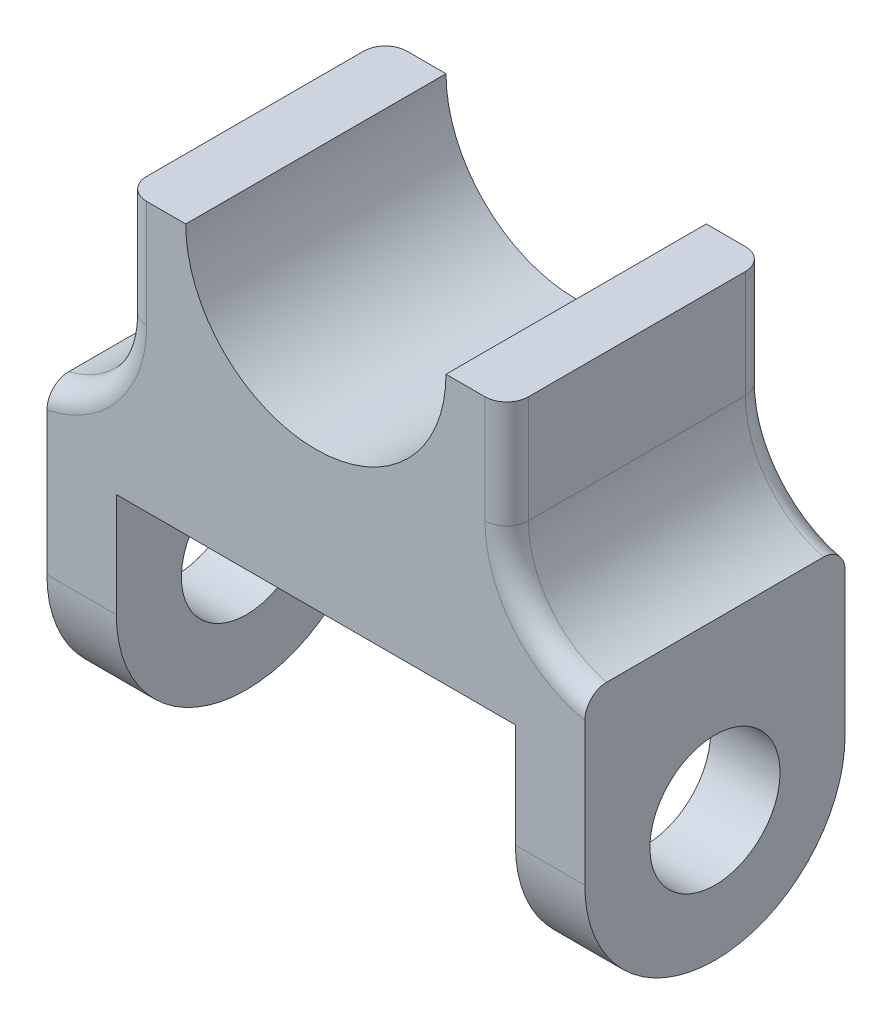
ISO-10303-21;
HEADER;
FILE_DESCRIPTION(('STEP AP214'),'2;1');
FILE_NAME('part.step','',(''),(''),'','','');
FILE_SCHEMA(('AUTOMOTIVE_DESIGN { 1 0 10303 214 1 1 1 1 }'));
ENDSEC;
DATA;
#1=APPLICATION_CONTEXT('core data for automotive mechanical design processes');
#2=APPLICATION_PROTOCOL_DEFINITION('international standard','automotive_design',2000,#1);
#3=PRODUCT_CONTEXT('',#1,'mechanical');
#4=PRODUCT('Part','Part','',(#3));
#5=PRODUCT_RELATED_PRODUCT_CATEGORY('part','',(#4));
#6=PRODUCT_DEFINITION_FORMATION('','',#4);
#7=PRODUCT_DEFINITION_CONTEXT('part definition',#1,'design');
#8=PRODUCT_DEFINITION('design','',#6,#7);
#9=PRODUCT_DEFINITION_SHAPE('','',#8);
#10=(LENGTH_UNIT() NAMED_UNIT(*) SI_UNIT(.MILLI.,.METRE.));
#11=(NAMED_UNIT(*) PLANE_ANGLE_UNIT() SI_UNIT($,.RADIAN.));
#12=(NAMED_UNIT(*) SI_UNIT($,.STERADIAN.) SOLID_ANGLE_UNIT());
#13=UNCERTAINTY_MEASURE_WITH_UNIT(LENGTH_MEASURE(1.E-05),#10,'distance_accuracy_value','');
#14=(GEOMETRIC_REPRESENTATION_CONTEXT(3) GLOBAL_UNCERTAINTY_ASSIGNED_CONTEXT((#13)) GLOBAL_UNIT_ASSIGNED_CONTEXT((#10,
#11,#12)) REPRESENTATION_CONTEXT('',''));
#15=CARTESIAN_POINT('',(0.,0.,0.));
#16=DIRECTION('',(0.,0.,1.));
#17=DIRECTION('',(1.,0.,0.));
#18=AXIS2_PLACEMENT_3D('',#15,#16,#17);
#19=CARTESIAN_POINT('',(18.,116.,-30.));
#20=DIRECTION('',(0.,-1.,0.));
#21=DIRECTION('',(0.,0.,-1.));
#22=AXIS2_PLACEMENT_3D('',#19,#20,#21);
#23=PLANE('',#22);
#24=DIRECTION('',(0.,0.,1.));
#25=VECTOR('',#24,1.);
#26=CARTESIAN_POINT('',(18.,116.,-30.));
#27=LINE('',#26,#25);
#28=CARTESIAN_POINT('',(18.,116.,-25.));
#29=VERTEX_POINT('',#28);
#30=CARTESIAN_POINT('',(18.,116.,25.));
#31=VERTEX_POINT('',#30);
#32=EDGE_CURVE('E248',#29,#31,#27,.T.);
#33=ORIENTED_EDGE('',*,*,#32,.T.);
#34=CARTESIAN_POINT('',(23.,116.,25.));
#35=DIRECTION('',(0.,-1.,0.));
#36=DIRECTION('',(0.,0.,-1.));
#37=AXIS2_PLACEMENT_3D('',#34,#35,#36);
#38=CIRCLE('',#37,5.);
#39=CARTESIAN_POINT('',(23.,116.,30.));
#40=VERTEX_POINT('',#39);
#41=EDGE_CURVE('E189',#31,#40,#38,.F.);
#42=ORIENTED_EDGE('',*,*,#41,.T.);
#43=DIRECTION('',(1.,0.,0.));
#44=VECTOR('',#43,1.);
#45=CARTESIAN_POINT('',(18.,116.,30.));
#46=LINE('',#45,#44);
#47=CARTESIAN_POINT('',(32.,116.,30.));
#48=VERTEX_POINT('',#47);
#49=EDGE_CURVE('E183',#40,#48,#46,.T.);
#50=ORIENTED_EDGE('',*,*,#49,.T.);
#51=DIRECTION('',(0.,0.,1.));
#52=VECTOR('',#51,1.);
#53=CARTESIAN_POINT('',(32.,116.,-30.));
#54=LINE('',#53,#52);
#55=CARTESIAN_POINT('',(32.,116.,-30.));
#56=VERTEX_POINT('',#55);
#57=EDGE_CURVE('E187',#56,#48,#54,.T.);
#58=ORIENTED_EDGE('',*,*,#57,.F.);
#59=DIRECTION('',(1.,0.,0.));
#60=VECTOR('',#59,1.);
#61=CARTESIAN_POINT('',(18.,116.,-30.));
#62=LINE('',#61,#60);
#63=CARTESIAN_POINT('',(23.,116.,-30.));
#64=VERTEX_POINT('',#63);
#65=EDGE_CURVE('E228',#64,#56,#62,.T.);
#66=ORIENTED_EDGE('',*,*,#65,.F.);
#67=CARTESIAN_POINT('',(23.,116.,-25.));
#68=DIRECTION('',(0.,-1.,0.));
#69=DIRECTION('',(0.,0.,-1.));
#70=AXIS2_PLACEMENT_3D('',#67,#68,#69);
#71=CIRCLE('',#70,5.);
#72=EDGE_CURVE('E427',#64,#29,#71,.F.);
#73=ORIENTED_EDGE('',*,*,#72,.T.);
#74=EDGE_LOOP('',(#33,#42,#50,#58,#66,#73));
#75=FACE_BOUND('',#74,.T.);
#76=ADVANCED_FACE('F33',(#75),#23,.F.);
#77=CARTESIAN_POINT('',(62.,116.,-30.));
#78=DIRECTION('',(0.,0.,1.));
#79=DIRECTION('',(1.,0.,0.));
#80=AXIS2_PLACEMENT_3D('',#77,#78,#79);
#81=CYLINDRICAL_SURFACE('',#80,30.);
#82=ORIENTED_EDGE('',*,*,#57,.T.);
#83=CARTESIAN_POINT('',(62.,116.,30.));
#84=DIRECTION('',(0.,0.,1.));
#85=DIRECTION('',(1.,0.,0.));
#86=AXIS2_PLACEMENT_3D('',#83,#84,#85);
#87=CIRCLE('',#86,30.);
#88=CARTESIAN_POINT('',(92.,116.,30.));
#89=VERTEX_POINT('',#88);
#90=EDGE_CURVE('E193',#48,#89,#87,.T.);
#91=ORIENTED_EDGE('',*,*,#90,.T.);
#92=DIRECTION('',(0.,0.,1.));
#93=VECTOR('',#92,1.);
#94=CARTESIAN_POINT('',(92.,116.,-30.));
#95=LINE('',#94,#93);
#96=CARTESIAN_POINT('',(92.,116.,-30.));
#97=VERTEX_POINT('',#96);
#98=EDGE_CURVE('E203',#97,#89,#95,.T.);
#99=ORIENTED_EDGE('',*,*,#98,.F.);
#100=CARTESIAN_POINT('',(62.,116.,-30.));
#101=DIRECTION('',(0.,0.,1.));
#102=DIRECTION('',(1.,0.,0.));
#103=AXIS2_PLACEMENT_3D('',#100,#101,#102);
#104=CIRCLE('',#103,30.);
#105=EDGE_CURVE('E201',#56,#97,#104,.T.);
#106=ORIENTED_EDGE('',*,*,#105,.F.);
#107=EDGE_LOOP('',(#82,#91,#99,#106));
#108=FACE_BOUND('',#107,.T.);
#109=ADVANCED_FACE('F199',(#108),#81,.F.);
#110=CARTESIAN_POINT('',(92.,116.,-30.));
#111=DIRECTION('',(0.,-1.,0.));
#112=DIRECTION('',(0.,0.,-1.));
#113=AXIS2_PLACEMENT_3D('',#110,#111,#112);
#114=PLANE('',#113);
#115=DIRECTION('',(0.,0.,1.));
#116=VECTOR('',#115,1.);
#117=CARTESIAN_POINT('',(106.,116.,-30.));
#118=LINE('',#117,#116);
#119=CARTESIAN_POINT('',(106.,116.,-25.));
#120=VERTEX_POINT('',#119);
#121=CARTESIAN_POINT('',(106.,116.,25.));
#122=VERTEX_POINT('',#121);
#123=EDGE_CURVE('E266',#120,#122,#118,.T.);
#124=ORIENTED_EDGE('',*,*,#123,.F.);
#125=CARTESIAN_POINT('',(101.,116.,-25.));
#126=DIRECTION('',(0.,-1.,0.));
#127=DIRECTION('',(0.,0.,-1.));
#128=AXIS2_PLACEMENT_3D('',#125,#126,#127);
#129=CIRCLE('',#128,5.);
#130=CARTESIAN_POINT('',(101.,116.,-30.));
#131=VERTEX_POINT('',#130);
#132=EDGE_CURVE('E378',#120,#131,#129,.F.);
#133=ORIENTED_EDGE('',*,*,#132,.T.);
#134=DIRECTION('',(1.,0.,0.));
#135=VECTOR('',#134,1.);
#136=CARTESIAN_POINT('',(92.,116.,-30.));
#137=LINE('',#136,#135);
#138=EDGE_CURVE('E231',#97,#131,#137,.T.);
#139=ORIENTED_EDGE('',*,*,#138,.F.);
#140=ORIENTED_EDGE('',*,*,#98,.T.);
#141=DIRECTION('',(1.,0.,0.));
#142=VECTOR('',#141,1.);
#143=CARTESIAN_POINT('',(92.,116.,30.));
#144=LINE('',#143,#142);
#145=CARTESIAN_POINT('',(101.,116.,30.));
#146=VERTEX_POINT('',#145);
#147=EDGE_CURVE('E210',#89,#146,#144,.T.);
#148=ORIENTED_EDGE('',*,*,#147,.T.);
#149=CARTESIAN_POINT('',(101.,116.,25.));
#150=DIRECTION('',(0.,-1.,0.));
#151=DIRECTION('',(0.,0.,-1.));
#152=AXIS2_PLACEMENT_3D('',#149,#150,#151);
#153=CIRCLE('',#152,5.);
#154=EDGE_CURVE('E458',#146,#122,#153,.F.);
#155=ORIENTED_EDGE('',*,*,#154,.T.);
#156=EDGE_LOOP('',(#124,#133,#139,#140,#148,#155));
#157=FACE_BOUND('',#156,.T.);
#158=ADVANCED_FACE('F351',(#157),#114,.F.);
#159=CARTESIAN_POINT('',(106.,91.2379000772445,-30.));
#160=DIRECTION('',(1.,0.,0.));
#161=DIRECTION('',(0.,1.,0.));
#162=AXIS2_PLACEMENT_3D('',#159,#160,#161);
#163=PLANE('',#162);
#164=DIRECTION('',(0.,0.,1.));
#165=VECTOR('',#164,1.);
#166=CARTESIAN_POINT('',(106.,91.2379000772445,-30.));
#167=LINE('',#166,#165);
#168=CARTESIAN_POINT('',(106.,91.2379000772445,-25.));
#169=VERTEX_POINT('',#168);
#170=CARTESIAN_POINT('',(106.,91.2379000772445,25.));
#171=VERTEX_POINT('',#170);
#172=EDGE_CURVE('E263',#169,#171,#167,.T.);
#173=ORIENTED_EDGE('',*,*,#172,.F.);
#174=DIRECTION('',(0.,1.,0.));
#175=VECTOR('',#174,1.);
#176=CARTESIAN_POINT('',(106.,116.,-25.));
#177=LINE('',#176,#175);
#178=EDGE_CURVE('E469',#169,#120,#177,.T.);
#179=ORIENTED_EDGE('',*,*,#178,.T.);
#180=ORIENTED_EDGE('',*,*,#123,.T.);
#181=DIRECTION('',(0.,1.,0.));
#182=VECTOR('',#181,1.);
#183=CARTESIAN_POINT('',(106.,91.2379000772445,25.));
#184=LINE('',#183,#182);
#185=EDGE_CURVE('E326',#122,#171,#184,.F.);
#186=ORIENTED_EDGE('',*,*,#185,.T.);
#187=EDGE_LOOP('',(#173,#179,#180,#186));
#188=FACE_BOUND('',#187,.T.);
#189=ADVANCED_FACE('F347',(#188),#163,.T.);
#190=CARTESIAN_POINT('',(130.,91.2379000772445,-30.));
#191=DIRECTION('',(0.,0.,1.));
#192=DIRECTION('',(1.,0.,0.));
#193=AXIS2_PLACEMENT_3D('',#190,#191,#192);
#194=CYLINDRICAL_SURFACE('',#193,24.);
#195=DIRECTION('',(0.,0.,1.));
#196=VECTOR('',#195,1.);
#197=CARTESIAN_POINT('',(124.,68.,-30.));
#198=LINE('',#197,#196);
#199=CARTESIAN_POINT('',(124.,68.,-25.));
#200=VERTEX_POINT('',#199);
#201=CARTESIAN_POINT('',(124.,68.,25.));
#202=VERTEX_POINT('',#201);
#203=EDGE_CURVE('E260',#200,#202,#198,.T.);
#204=ORIENTED_EDGE('',*,*,#203,.F.);
#205=CARTESIAN_POINT('',(130.,91.2379000772445,-25.));
#206=DIRECTION('',(0.,0.,1.));
#207=DIRECTION('',(1.,0.,0.));
#208=AXIS2_PLACEMENT_3D('',#205,#206,#207);
#209=CIRCLE('',#208,24.);
#210=EDGE_CURVE('E440',#200,#169,#209,.F.);
#211=ORIENTED_EDGE('',*,*,#210,.T.);
#212=ORIENTED_EDGE('',*,*,#172,.T.);
#213=CARTESIAN_POINT('',(130.,91.2379000772445,25.));
#214=DIRECTION('',(0.,0.,1.));
#215=DIRECTION('',(1.,0.,0.));
#216=AXIS2_PLACEMENT_3D('',#213,#214,#215);
#217=CIRCLE('',#216,24.);
#218=EDGE_CURVE('E439',#171,#202,#217,.T.);
#219=ORIENTED_EDGE('',*,*,#218,.T.);
#220=EDGE_LOOP('',(#204,#211,#212,#219));
#221=FACE_BOUND('',#220,.T.);
#222=ADVANCED_FACE('F341',(#221),#194,.F.);
#223=CARTESIAN_POINT('',(124.,68.,-30.));
#224=DIRECTION('',(-1.,0.,0.));
#225=DIRECTION('',(0.,0.,1.));
#226=AXIS2_PLACEMENT_3D('',#223,#224,#225);
#227=PLANE('',#226);
#228=CARTESIAN_POINT('',(124.,30.,0.));
#229=DIRECTION('',(1.,0.,0.));
#230=DIRECTION('',(0.,0.,-1.));
#231=AXIS2_PLACEMENT_3D('',#228,#229,#230);
#232=CIRCLE('',#231,15.);
#233=CARTESIAN_POINT('',(124.,30.,-15.));
#234=VERTEX_POINT('',#233);
#235=EDGE_CURVE('E409',#234,#234,#232,.T.);
#236=ORIENTED_EDGE('',*,*,#235,.F.);
#237=EDGE_LOOP('',(#236));
#238=FACE_BOUND('',#237,.T.);
#239=CARTESIAN_POINT('',(124.,30.,0.));
#240=DIRECTION('',(-1.,0.,0.));
#241=DIRECTION('',(0.,0.,1.));
#242=AXIS2_PLACEMENT_3D('',#239,#240,#241);
#243=CIRCLE('',#242,30.);
#244=CARTESIAN_POINT('',(124.,30.,30.));
#245=VERTEX_POINT('',#244);
#246=CARTESIAN_POINT('',(124.,0.,0.));
#247=VERTEX_POINT('',#246);
#248=EDGE_CURVE('E386',#245,#247,#243,.F.);
#249=ORIENTED_EDGE('',*,*,#248,.T.);
#250=CARTESIAN_POINT('',(124.,30.,0.));
#251=DIRECTION('',(-1.,0.,0.));
#252=DIRECTION('',(0.,0.,1.));
#253=AXIS2_PLACEMENT_3D('',#250,#251,#252);
#254=CIRCLE('',#253,30.);
#255=CARTESIAN_POINT('',(124.,30.,-30.));
#256=VERTEX_POINT('',#255);
#257=EDGE_CURVE('E388',#247,#256,#254,.F.);
#258=ORIENTED_EDGE('',*,*,#257,.T.);
#259=DIRECTION('',(0.,-1.,0.));
#260=VECTOR('',#259,1.);
#261=CARTESIAN_POINT('',(124.,68.,-30.));
#262=LINE('',#261,#260);
#263=CARTESIAN_POINT('',(124.,62.8653781590223,-30.));
#264=VERTEX_POINT('',#263);
#265=EDGE_CURVE('E234',#264,#256,#262,.T.);
#266=ORIENTED_EDGE('',*,*,#265,.F.);
#267=CARTESIAN_POINT('',(124.,62.8653781590223,-30.));
#268=CARTESIAN_POINT('',(124.,63.0122940338637,-30.0000135776394));
#269=CARTESIAN_POINT('',(124.,63.1592065071418,-29.9938024660776));
#270=CARTESIAN_POINT('',(124.,63.4519839518163,-29.969054438055));
#271=CARTESIAN_POINT('',(124.,63.5978489664205,-29.9505180329985));
#272=CARTESIAN_POINT('',(124.,63.8874611498896,-29.9012501184049));
#273=CARTESIAN_POINT('',(124.,64.0312089207738,-29.8705221476749));
#274=CARTESIAN_POINT('',(124.,64.3156104273313,-29.7970880969287));
#275=CARTESIAN_POINT('',(124.,64.4562641931266,-29.754382133581));
#276=CARTESIAN_POINT('',(124.,64.7335237252092,-29.657258780158));
#277=CARTESIAN_POINT('',(124.,64.8701280795368,-29.6028373585042));
#278=CARTESIAN_POINT('',(124.,65.1383018309479,-29.4826266097469));
#279=CARTESIAN_POINT('',(124.,65.2698693503571,-29.4168330927053));
#280=CARTESIAN_POINT('',(124.,65.5268733780694,-29.2743637863013));
#281=CARTESIAN_POINT('',(124.,65.6523134896175,-29.1976944986169));
#282=CARTESIAN_POINT('',(124.,65.8962486592245,-29.0339174673058));
#283=CARTESIAN_POINT('',(124.,66.0147413284504,-28.9468061642415));
#284=CARTESIAN_POINT('',(124.,66.2430554381664,-28.7633597130894));
#285=CARTESIAN_POINT('',(124.,66.3529296101739,-28.6670902068707));
#286=CARTESIAN_POINT('',(124.,66.5640174779562,-28.4654844741474));
#287=CARTESIAN_POINT('',(124.,66.6652313900336,-28.3601484742235));
#288=CARTESIAN_POINT('',(124.,66.8582168680808,-28.1410858053804));
#289=CARTESIAN_POINT('',(124.,66.9499850741085,-28.0273561752844));
#290=CARTESIAN_POINT('',(124.,67.1232350871389,-27.7923796086145));
#291=CARTESIAN_POINT('',(124.,67.2047209484629,-27.6711356632265));
#292=CARTESIAN_POINT('',(124.,67.3549691378116,-27.4248669231467));
#293=CARTESIAN_POINT('',(124.,67.423983555175,-27.2999959058746));
#294=CARTESIAN_POINT('',(124.,67.5509478742848,-27.0448111656454));
#295=CARTESIAN_POINT('',(124.,67.6089023373178,-26.9144997135447));
#296=CARTESIAN_POINT('',(124.,67.7132342796386,-26.6494170526502));
#297=CARTESIAN_POINT('',(124.,67.7596193148504,-26.5146488200439));
#298=CARTESIAN_POINT('',(124.,67.8404295884826,-26.2416244764882));
#299=CARTESIAN_POINT('',(124.,67.874858739803,-26.103369522586));
#300=CARTESIAN_POINT('',(124.,67.9353221371547,-25.8052638068017));
#301=CARTESIAN_POINT('',(124.,67.9595635197684,-25.6450461886431));
#302=CARTESIAN_POINT('',(124.,67.9919100554711,-25.3232165741672));
#303=CARTESIAN_POINT('',(124.,68.0000375431522,-25.161606820106));
#304=CARTESIAN_POINT('',(124.,68.,-25.));
#305=B_SPLINE_CURVE_WITH_KNOTS('',3,(#267,#268,#269,#270,#271,#272,#273,#274,#275,#276,#277,
#278,#279,#280,#281,#282,#283,#284,#285,#286,#287,#288,#289,#290,#291,#292,#293,#294,#295,#296,
#297,#298,#299,#300,#301,#302,#303,#304),.UNSPECIFIED.,.F.,.F.,(4,2,2,2,2,2,2,2,2,2,2,2,2,2,2,2,
2,2,4),(0.,0.440611682578454,0.881205084324523,1.32167068987529,1.76213200533449,
2.20274513739992,2.64352095649117,3.08403437588854,3.52469838526753,3.96241284319073,
4.40011636537123,4.83797504935191,5.27566054286794,5.70315439315733,6.13047155591927,
6.55750890531459,6.98440636268739,7.46970638694025,7.95433329170102),.UNSPECIFIED.);
#306=EDGE_CURVE('E318',#264,#200,#305,.T.);
#307=ORIENTED_EDGE('',*,*,#306,.T.);
#308=ORIENTED_EDGE('',*,*,#203,.T.);
#309=CARTESIAN_POINT('',(124.,68.,25.));
#310=CARTESIAN_POINT('',(124.,68.0000185242085,25.1375899207116));
#311=CARTESIAN_POINT('',(124.,67.9941352490274,25.2751756715424));
#312=CARTESIAN_POINT('',(124.,67.9707002144264,25.5493333384995));
#313=CARTESIAN_POINT('',(124.,67.9531498999687,25.6859053780561));
#314=CARTESIAN_POINT('',(124.,67.906556115088,25.9568305049059));
#315=CARTESIAN_POINT('',(124.,67.8775325491639,26.0911870175249));
#316=CARTESIAN_POINT('',(124.,67.8082499217616,26.356970051477));
#317=CARTESIAN_POINT('',(124.,67.7679908277631,26.4883965643283));
#318=CARTESIAN_POINT('',(124.,67.6765832465836,26.7473906165616));
#319=CARTESIAN_POINT('',(124.,67.6254357921181,26.8749585206069));
#320=CARTESIAN_POINT('',(124.,67.5126540684478,27.1254256566415));
#321=CARTESIAN_POINT('',(124.,67.4510159275805,27.248323144422));
#322=CARTESIAN_POINT('',(124.,67.3177823506879,27.4885497294146));
#323=CARTESIAN_POINT('',(124.,67.2461896739435,27.6058803576487));
#324=CARTESIAN_POINT('',(124.,67.0935663394551,27.8342936950822));
#325=CARTESIAN_POINT('',(124.,67.0125321522326,27.9453740446076));
#326=CARTESIAN_POINT('',(124.,66.840384722092,28.1621467616383));
#327=CARTESIAN_POINT('',(124.,66.7491392075818,28.2677340918365));
#328=CARTESIAN_POINT('',(124.,66.5582358130544,28.4710745477321));
#329=CARTESIAN_POINT('',(124.,66.4585748380572,28.5688247651582));
#330=CARTESIAN_POINT('',(124.,66.2515993605644,28.7558385162318));
#331=CARTESIAN_POINT('',(124.,66.1442858445951,28.8451031403493));
#332=CARTESIAN_POINT('',(124.,65.9227545716082,29.0146341995782));
#333=CARTESIAN_POINT('',(124.,65.8085343160184,29.0948973479903));
#334=CARTESIAN_POINT('',(124.,65.4499705424497,29.3257324711916));
#335=CARTESIAN_POINT('',(124.,65.1955677593031,29.4610642940875));
#336=CARTESIAN_POINT('',(124.,64.6681372145287,29.6879610647596));
#337=CARTESIAN_POINT('',(124.,64.3951152045385,29.7795394589872));
#338=CARTESIAN_POINT('',(124.,63.9119273544545,29.8985435666656));
#339=CARTESIAN_POINT('',(124.,63.7043086751974,29.9365445562826));
#340=CARTESIAN_POINT('',(124.,63.2862755432094,29.9872777314859));
#341=CARTESIAN_POINT('',(124.,63.0758649653899,30.0000418669332));
#342=CARTESIAN_POINT('',(124.,62.8653781590223,30.));
#343=B_SPLINE_CURVE_WITH_KNOTS('',3,(#309,#310,#311,#312,#313,#314,#315,#316,#317,#318,#319,
#320,#321,#322,#323,#324,#325,#326,#327,#328,#329,#330,#331,#332,#333,#334,#335,#336,#337,#338,
#339,#340,#341,#342),.UNSPECIFIED.,.F.,.F.,(4,2,2,2,2,2,2,2,2,2,2,2,2,2,2,2,4),(0.,
0.41263777906513,0.825224462484417,1.23709848463722,1.64897369893195,2.06080986597302,
2.47279835497971,2.88467287241511,3.29670185610767,3.71487459134385,4.13320179472653,
4.5514751666718,4.96990076849998,5.83010764938298,6.69004999826526,7.32178153311657,
7.95271278234536),.UNSPECIFIED.);
#344=CARTESIAN_POINT('',(124.,62.8653781590223,30.));
#345=VERTEX_POINT('',#344);
#346=EDGE_CURVE('E327',#202,#345,#343,.T.);
#347=ORIENTED_EDGE('',*,*,#346,.T.);
#348=DIRECTION('',(0.,-1.,0.));
#349=VECTOR('',#348,1.);
#350=CARTESIAN_POINT('',(124.,68.,30.));
#351=LINE('',#350,#349);
#352=EDGE_CURVE('E212',#345,#245,#351,.T.);
#353=ORIENTED_EDGE('',*,*,#352,.T.);
#354=EDGE_LOOP('',(#249,#258,#266,#307,#308,#347,#353));
#355=FACE_BOUND('',#354,.T.);
#356=ADVANCED_FACE('F335',(#238,#355),#227,.F.);
#357=CARTESIAN_POINT('',(108.,54.,-30.));
#358=DIRECTION('',(-1.,0.,0.));
#359=DIRECTION('',(0.,0.,1.));
#360=AXIS2_PLACEMENT_3D('',#357,#358,#359);
#361=PLANE('',#360);
#362=CARTESIAN_POINT('',(108.,30.,0.));
#363=DIRECTION('',(-1.,0.,0.));
#364=DIRECTION('',(0.,0.,1.));
#365=AXIS2_PLACEMENT_3D('',#362,#363,#364);
#366=CIRCLE('',#365,15.);
#367=CARTESIAN_POINT('',(108.,30.,15.));
#368=VERTEX_POINT('',#367);
#369=EDGE_CURVE('E385',#368,#368,#366,.T.);
#370=ORIENTED_EDGE('',*,*,#369,.F.);
#371=EDGE_LOOP('',(#370));
#372=FACE_BOUND('',#371,.T.);
#373=DIRECTION('',(0.,-1.,0.));
#374=VECTOR('',#373,1.);
#375=CARTESIAN_POINT('',(108.,54.,-30.));
#376=LINE('',#375,#374);
#377=CARTESIAN_POINT('',(108.,54.,-30.));
#378=VERTEX_POINT('',#377);
#379=CARTESIAN_POINT('',(108.,30.,-30.));
#380=VERTEX_POINT('',#379);
#381=EDGE_CURVE('E237',#378,#380,#376,.T.);
#382=ORIENTED_EDGE('',*,*,#381,.T.);
#383=CARTESIAN_POINT('',(108.,30.,0.));
#384=DIRECTION('',(-1.,0.,0.));
#385=DIRECTION('',(0.,0.,1.));
#386=AXIS2_PLACEMENT_3D('',#383,#384,#385);
#387=CIRCLE('',#386,30.);
#388=CARTESIAN_POINT('',(108.,0.,0.));
#389=VERTEX_POINT('',#388);
#390=EDGE_CURVE('E398',#380,#389,#387,.T.);
#391=ORIENTED_EDGE('',*,*,#390,.T.);
#392=CARTESIAN_POINT('',(108.,30.,0.));
#393=DIRECTION('',(-1.,0.,0.));
#394=DIRECTION('',(0.,0.,1.));
#395=AXIS2_PLACEMENT_3D('',#392,#393,#394);
#396=CIRCLE('',#395,30.);
#397=CARTESIAN_POINT('',(108.,30.,30.));
#398=VERTEX_POINT('',#397);
#399=EDGE_CURVE('E396',#389,#398,#396,.T.);
#400=ORIENTED_EDGE('',*,*,#399,.T.);
#401=DIRECTION('',(0.,-1.,0.));
#402=VECTOR('',#401,1.);
#403=CARTESIAN_POINT('',(108.,54.,30.));
#404=LINE('',#403,#402);
#405=CARTESIAN_POINT('',(108.,54.,30.));
#406=VERTEX_POINT('',#405);
#407=EDGE_CURVE('E218',#406,#398,#404,.T.);
#408=ORIENTED_EDGE('',*,*,#407,.F.);
#409=DIRECTION('',(0.,0.,1.));
#410=VECTOR('',#409,1.);
#411=CARTESIAN_POINT('',(108.,54.,-30.));
#412=LINE('',#411,#410);
#413=EDGE_CURVE('E258',#378,#406,#412,.T.);
#414=ORIENTED_EDGE('',*,*,#413,.F.);
#415=EDGE_LOOP('',(#382,#391,#400,#408,#414));
#416=FACE_BOUND('',#415,.T.);
#417=ADVANCED_FACE('F340',(#372,#416),#361,.T.);
#418=CARTESIAN_POINT('',(16.,54.,-30.));
#419=DIRECTION('',(0.,-1.,0.));
#420=DIRECTION('',(0.,0.,-1.));
#421=AXIS2_PLACEMENT_3D('',#418,#419,#420);
#422=PLANE('',#421);
#423=ORIENTED_EDGE('',*,*,#413,.T.);
#424=DIRECTION('',(1.,0.,0.));
#425=VECTOR('',#424,1.);
#426=CARTESIAN_POINT('',(16.,54.,30.));
#427=LINE('',#426,#425);
#428=CARTESIAN_POINT('',(16.,54.,30.));
#429=VERTEX_POINT('',#428);
#430=EDGE_CURVE('E220',#429,#406,#427,.T.);
#431=ORIENTED_EDGE('',*,*,#430,.F.);
#432=DIRECTION('',(0.,0.,1.));
#433=VECTOR('',#432,1.);
#434=CARTESIAN_POINT('',(16.,54.,-30.));
#435=LINE('',#434,#433);
#436=CARTESIAN_POINT('',(16.,54.,-30.));
#437=VERTEX_POINT('',#436);
#438=EDGE_CURVE('E256',#437,#429,#435,.T.);
#439=ORIENTED_EDGE('',*,*,#438,.F.);
#440=DIRECTION('',(1.,0.,0.));
#441=VECTOR('',#440,1.);
#442=CARTESIAN_POINT('',(16.,54.,-30.));
#443=LINE('',#442,#441);
#444=EDGE_CURVE('E240',#437,#378,#443,.T.);
#445=ORIENTED_EDGE('',*,*,#444,.T.);
#446=EDGE_LOOP('',(#423,#431,#439,#445));
#447=FACE_BOUND('',#446,.T.);
#448=ADVANCED_FACE('F481',(#447),#422,.T.);
#449=CARTESIAN_POINT('',(16.,54.,-30.));
#450=DIRECTION('',(-1.,0.,0.));
#451=DIRECTION('',(0.,-1.,0.));
#452=AXIS2_PLACEMENT_3D('',#449,#450,#451);
#453=PLANE('',#452);
#454=CARTESIAN_POINT('',(16.,30.,0.));
#455=DIRECTION('',(-1.,0.,0.));
#456=DIRECTION('',(0.,-1.,0.));
#457=AXIS2_PLACEMENT_3D('',#454,#455,#456);
#458=CIRCLE('',#457,15.);
#459=CARTESIAN_POINT('',(16.,15.,0.));
#460=VERTEX_POINT('',#459);
#461=EDGE_CURVE('E531',#460,#460,#458,.T.);
#462=ORIENTED_EDGE('',*,*,#461,.T.);
#463=EDGE_LOOP('',(#462));
#464=FACE_BOUND('',#463,.T.);
#465=CARTESIAN_POINT('',(16.,30.,0.));
#466=DIRECTION('',(-1.,0.,0.));
#467=DIRECTION('',(0.,-1.,0.));
#468=AXIS2_PLACEMENT_3D('',#465,#466,#467);
#469=CIRCLE('',#468,30.);
#470=CARTESIAN_POINT('',(16.,30.,30.));
#471=VERTEX_POINT('',#470);
#472=CARTESIAN_POINT('',(16.,0.,0.));
#473=VERTEX_POINT('',#472);
#474=EDGE_CURVE('E56',#471,#473,#469,.F.);
#475=ORIENTED_EDGE('',*,*,#474,.T.);
#476=CARTESIAN_POINT('',(16.,30.,0.));
#477=DIRECTION('',(-1.,0.,0.));
#478=DIRECTION('',(0.,-1.,0.));
#479=AXIS2_PLACEMENT_3D('',#476,#477,#478);
#480=CIRCLE('',#479,30.);
#481=CARTESIAN_POINT('',(16.,30.,-30.));
#482=VERTEX_POINT('',#481);
#483=EDGE_CURVE('E405',#473,#482,#480,.F.);
#484=ORIENTED_EDGE('',*,*,#483,.T.);
#485=DIRECTION('',(0.,-1.,0.));
#486=VECTOR('',#485,1.);
#487=CARTESIAN_POINT('',(16.,54.,-30.));
#488=LINE('',#487,#486);
#489=EDGE_CURVE('E243',#437,#482,#488,.T.);
#490=ORIENTED_EDGE('',*,*,#489,.F.);
#491=ORIENTED_EDGE('',*,*,#438,.T.);
#492=DIRECTION('',(0.,-1.,0.));
#493=VECTOR('',#492,1.);
#494=CARTESIAN_POINT('',(16.,54.,30.));
#495=LINE('',#494,#493);
#496=EDGE_CURVE('E223',#429,#471,#495,.T.);
#497=ORIENTED_EDGE('',*,*,#496,.T.);
#498=EDGE_LOOP('',(#475,#484,#490,#491,#497));
#499=FACE_BOUND('',#498,.T.);
#500=ADVANCED_FACE('F482',(#464,#499),#453,.F.);
#501=CARTESIAN_POINT('',(0.,68.,-30.));
#502=DIRECTION('',(-1.,0.,0.));
#503=DIRECTION('',(0.,-1.,0.));
#504=AXIS2_PLACEMENT_3D('',#501,#502,#503);
#505=PLANE('',#504);
#506=CARTESIAN_POINT('',(0.,30.,0.));
#507=DIRECTION('',(1.,0.,0.));
#508=DIRECTION('',(0.,0.,-1.));
#509=AXIS2_PLACEMENT_3D('',#506,#507,#508);
#510=CIRCLE('',#509,15.);
#511=CARTESIAN_POINT('',(0.,30.,-15.));
#512=VERTEX_POINT('',#511);
#513=EDGE_CURVE('E414',#512,#512,#510,.T.);
#514=ORIENTED_EDGE('',*,*,#513,.T.);
#515=EDGE_LOOP('',(#514));
#516=FACE_BOUND('',#515,.T.);
#517=DIRECTION('',(0.,-1.,0.));
#518=VECTOR('',#517,1.);
#519=CARTESIAN_POINT('',(0.,68.,-30.));
#520=LINE('',#519,#518);
#521=CARTESIAN_POINT('',(0.,62.8653781590223,-30.));
#522=VERTEX_POINT('',#521);
#523=CARTESIAN_POINT('',(0.,30.,-30.));
#524=VERTEX_POINT('',#523);
#525=EDGE_CURVE('E246',#522,#524,#520,.T.);
#526=ORIENTED_EDGE('',*,*,#525,.T.);
#527=CARTESIAN_POINT('',(0.,30.,0.));
#528=DIRECTION('',(-1.,0.,0.));
#529=DIRECTION('',(0.,-1.,0.));
#530=AXIS2_PLACEMENT_3D('',#527,#528,#529);
#531=CIRCLE('',#530,30.);
#532=CARTESIAN_POINT('',(0.,0.,0.));
#533=VERTEX_POINT('',#532);
#534=EDGE_CURVE('E11',#524,#533,#531,.T.);
#535=ORIENTED_EDGE('',*,*,#534,.T.);
#536=CARTESIAN_POINT('',(0.,30.,0.));
#537=DIRECTION('',(-1.,0.,0.));
#538=DIRECTION('',(0.,-1.,0.));
#539=AXIS2_PLACEMENT_3D('',#536,#537,#538);
#540=CIRCLE('',#539,30.);
#541=CARTESIAN_POINT('',(0.,30.,30.));
#542=VERTEX_POINT('',#541);
#543=EDGE_CURVE('E42',#533,#542,#540,.T.);
#544=ORIENTED_EDGE('',*,*,#543,.T.);
#545=DIRECTION('',(0.,-1.,0.));
#546=VECTOR('',#545,1.);
#547=CARTESIAN_POINT('',(0.,68.,30.));
#548=LINE('',#547,#546);
#549=CARTESIAN_POINT('',(0.,62.8653781590223,30.));
#550=VERTEX_POINT('',#549);
#551=EDGE_CURVE('E225',#550,#542,#548,.T.);
#552=ORIENTED_EDGE('',*,*,#551,.F.);
#553=CARTESIAN_POINT('',(0.,62.8653781590223,30.));
#554=CARTESIAN_POINT('',(0.,63.0122940338637,30.0000135776394));
#555=CARTESIAN_POINT('',(0.,63.1592065071417,29.9938024660776));
#556=CARTESIAN_POINT('',(0.,63.4519839518163,29.969054438055));
#557=CARTESIAN_POINT('',(0.,63.5978489664205,29.9505180329985));
#558=CARTESIAN_POINT('',(0.,63.8874611498896,29.9012501184049));
#559=CARTESIAN_POINT('',(0.,64.0312089207738,29.8705221476749));
#560=CARTESIAN_POINT('',(0.,64.3156104273313,29.7970880969287));
#561=CARTESIAN_POINT('',(0.,64.4562641931266,29.754382133581));
#562=CARTESIAN_POINT('',(0.,64.7335237252092,29.657258780158));
#563=CARTESIAN_POINT('',(0.,64.8701280795368,29.6028373585042));
#564=CARTESIAN_POINT('',(0.,65.1383018309479,29.4826266097469));
#565=CARTESIAN_POINT('',(0.,65.2698693503571,29.4168330927053));
#566=CARTESIAN_POINT('',(0.,65.5268733780694,29.2743637863013));
#567=CARTESIAN_POINT('',(0.,65.6523134896174,29.1976944986169));
#568=CARTESIAN_POINT('',(0.,65.8962486592245,29.0339174673058));
#569=CARTESIAN_POINT('',(0.,66.0147413284504,28.9468061642415));
#570=CARTESIAN_POINT('',(0.,66.2430554381664,28.7633597130894));
#571=CARTESIAN_POINT('',(0.,66.3529296101739,28.6670902068706));
#572=CARTESIAN_POINT('',(0.,66.5640174779562,28.4654844741474));
#573=CARTESIAN_POINT('',(0.,66.6652313900336,28.3601484742235));
#574=CARTESIAN_POINT('',(0.,66.8582168680808,28.1410858053804));
#575=CARTESIAN_POINT('',(0.,66.9499850741085,28.0273561752844));
#576=CARTESIAN_POINT('',(0.,67.1232350871389,27.7923796086145));
#577=CARTESIAN_POINT('',(0.,67.2047209484629,27.6711356632265));
#578=CARTESIAN_POINT('',(0.,67.3549691378116,27.4248669231467));
#579=CARTESIAN_POINT('',(0.,67.423983555175,27.2999959058746));
#580=CARTESIAN_POINT('',(0.,67.5509478742848,27.0448111656454));
#581=CARTESIAN_POINT('',(0.,67.6089023373178,26.9144997135447));
#582=CARTESIAN_POINT('',(0.,67.7132342796386,26.6494170526502));
#583=CARTESIAN_POINT('',(0.,67.7596193148504,26.5146488200439));
#584=CARTESIAN_POINT('',(0.,67.8404295884826,26.2416244764882));
#585=CARTESIAN_POINT('',(0.,67.874858739803,26.1033695225859));
#586=CARTESIAN_POINT('',(0.,67.9353221371546,25.8052638068017));
#587=CARTESIAN_POINT('',(0.,67.9595635197684,25.645046188643));
#588=CARTESIAN_POINT('',(0.,67.9919100554711,25.3232165741672));
#589=CARTESIAN_POINT('',(0.,68.0000375431522,25.161606820106));
#590=CARTESIAN_POINT('',(0.,68.,25.));
#591=B_SPLINE_CURVE_WITH_KNOTS('',3,(#553,#554,#555,#556,#557,#558,#559,#560,#561,#562,#563,
#564,#565,#566,#567,#568,#569,#570,#571,#572,#573,#574,#575,#576,#577,#578,#579,#580,#581,#582,
#583,#584,#585,#586,#587,#588,#589,#590),.UNSPECIFIED.,.F.,.F.,(4,2,2,2,2,2,2,2,2,2,2,2,2,2,2,2,
2,2,4),(0.,0.440611682578454,0.881205084324509,1.3216706898753,1.7621320053345,2.20274513739993,
2.64352095649117,3.08403437588852,3.52469838526754,3.96241284319075,4.40011636537125,
4.83797504935193,5.27566054286796,5.70315439315735,6.13047155591929,6.55750890531461,
6.98440636268741,7.46970638694028,7.95433329170103),.UNSPECIFIED.);
#592=CARTESIAN_POINT('',(0.,68.,25.));
#593=VERTEX_POINT('',#592);
#594=EDGE_CURVE('E286',#550,#593,#591,.T.);
#595=ORIENTED_EDGE('',*,*,#594,.T.);
#596=DIRECTION('',(0.,0.,1.));
#597=VECTOR('',#596,1.);
#598=CARTESIAN_POINT('',(0.,68.,-30.));
#599=LINE('',#598,#597);
#600=CARTESIAN_POINT('',(0.,68.,-25.));
#601=VERTEX_POINT('',#600);
#602=EDGE_CURVE('E253',#601,#593,#599,.T.);
#603=ORIENTED_EDGE('',*,*,#602,.F.);
#604=CARTESIAN_POINT('',(0.,68.,-25.));
#605=CARTESIAN_POINT('',(0.,68.0000185242085,-25.1375899207116));
#606=CARTESIAN_POINT('',(0.,67.9941352490274,-25.2751756715424));
#607=CARTESIAN_POINT('',(0.,67.9707002144264,-25.5493333384995));
#608=CARTESIAN_POINT('',(0.,67.9531498999687,-25.6859053780561));
#609=CARTESIAN_POINT('',(0.,67.906556115088,-25.9568305049059));
#610=CARTESIAN_POINT('',(0.,67.8775325491639,-26.0911870175249));
#611=CARTESIAN_POINT('',(0.,67.8082499217616,-26.356970051477));
#612=CARTESIAN_POINT('',(0.,67.7679908277631,-26.4883965643283));
#613=CARTESIAN_POINT('',(0.,67.6765832465836,-26.7473906165616));
#614=CARTESIAN_POINT('',(0.,67.6254357921181,-26.8749585206069));
#615=CARTESIAN_POINT('',(0.,67.5126540684478,-27.1254256566415));
#616=CARTESIAN_POINT('',(0.,67.4510159275805,-27.248323144422));
#617=CARTESIAN_POINT('',(0.,67.3177823506879,-27.4885497294146));
#618=CARTESIAN_POINT('',(0.,67.2461896739434,-27.6058803576487));
#619=CARTESIAN_POINT('',(0.,67.0935663394551,-27.8342936950822));
#620=CARTESIAN_POINT('',(0.,67.0125321522326,-27.9453740446076));
#621=CARTESIAN_POINT('',(0.,66.840384722092,-28.1621467616383));
#622=CARTESIAN_POINT('',(0.,66.7491392075818,-28.2677340918365));
#623=CARTESIAN_POINT('',(0.,66.5582358130543,-28.4710745477321));
#624=CARTESIAN_POINT('',(0.,66.4585748380572,-28.5688247651582));
#625=CARTESIAN_POINT('',(0.,66.2515993605644,-28.7558385162318));
#626=CARTESIAN_POINT('',(0.,66.144285844595,-28.8451031403493));
#627=CARTESIAN_POINT('',(0.,65.9227545716081,-29.0146341995782));
#628=CARTESIAN_POINT('',(0.,65.8085343160184,-29.0948973479903));
#629=CARTESIAN_POINT('',(0.,65.4499705424497,-29.3257324711916));
#630=CARTESIAN_POINT('',(0.,65.1955677593031,-29.4610642940875));
#631=CARTESIAN_POINT('',(0.,64.6681372145287,-29.6879610647596));
#632=CARTESIAN_POINT('',(0.,64.3951152045385,-29.7795394589872));
#633=CARTESIAN_POINT('',(0.,63.9119273544545,-29.8985435666656));
#634=CARTESIAN_POINT('',(0.,63.7043086751974,-29.9365445562826));
#635=CARTESIAN_POINT('',(0.,63.2862755432094,-29.9872777314859));
#636=CARTESIAN_POINT('',(0.,63.0758649653898,-30.0000418669332));
#637=CARTESIAN_POINT('',(0.,62.8653781590223,-30.));
#638=B_SPLINE_CURVE_WITH_KNOTS('',3,(#604,#605,#606,#607,#608,#609,#610,#611,#612,#613,#614,
#615,#616,#617,#618,#619,#620,#621,#622,#623,#624,#625,#626,#627,#628,#629,#630,#631,#632,#633,
#634,#635,#636,#637),.UNSPECIFIED.,.F.,.F.,(4,2,2,2,2,2,2,2,2,2,2,2,2,2,2,2,4),(0.,
0.412637779065131,0.825224462484414,1.23709848463722,1.64897369893195,2.06080986597303,
2.47279835497971,2.88467287241512,3.29670185610766,3.71487459134384,4.13320179472654,
4.55147516667181,4.96990076849999,5.83010764938301,6.69004999826526,7.32178153311659,
7.95271278234537),.UNSPECIFIED.);
#639=EDGE_CURVE('E278',#601,#522,#638,.T.);
#640=ORIENTED_EDGE('',*,*,#639,.T.);
#641=EDGE_LOOP('',(#526,#535,#544,#552,#595,#603,#640));
#642=FACE_BOUND('',#641,.T.);
#643=ADVANCED_FACE('F293',(#516,#642),#505,.T.);
#644=CARTESIAN_POINT('',(-6.,91.2379000772445,-30.));
#645=DIRECTION('',(0.,0.,1.));
#646=DIRECTION('',(1.,0.,0.));
#647=AXIS2_PLACEMENT_3D('',#644,#645,#646);
#648=CYLINDRICAL_SURFACE('',#647,24.);
#649=ORIENTED_EDGE('',*,*,#602,.T.);
#650=CARTESIAN_POINT('',(-6.,91.2379000772445,25.));
#651=DIRECTION('',(0.,0.,1.));
#652=DIRECTION('',(1.,0.,0.));
#653=AXIS2_PLACEMENT_3D('',#650,#651,#652);
#654=CIRCLE('',#653,24.);
#655=CARTESIAN_POINT('',(18.,91.2379000772445,25.));
#656=VERTEX_POINT('',#655);
#657=EDGE_CURVE('E370',#593,#656,#654,.T.);
#658=ORIENTED_EDGE('',*,*,#657,.T.);
#659=DIRECTION('',(0.,0.,1.));
#660=VECTOR('',#659,1.);
#661=CARTESIAN_POINT('',(18.,91.2379000772445,-30.));
#662=LINE('',#661,#660);
#663=CARTESIAN_POINT('',(18.,91.2379000772445,-25.));
#664=VERTEX_POINT('',#663);
#665=EDGE_CURVE('E250',#664,#656,#662,.T.);
#666=ORIENTED_EDGE('',*,*,#665,.F.);
#667=CARTESIAN_POINT('',(-6.,91.2379000772445,-25.));
#668=DIRECTION('',(0.,0.,1.));
#669=DIRECTION('',(1.,0.,0.));
#670=AXIS2_PLACEMENT_3D('',#667,#668,#669);
#671=CIRCLE('',#670,24.);
#672=EDGE_CURVE('E489',#664,#601,#671,.F.);
#673=ORIENTED_EDGE('',*,*,#672,.T.);
#674=EDGE_LOOP('',(#649,#658,#666,#673));
#675=FACE_BOUND('',#674,.T.);
#676=ADVANCED_FACE('F492',(#675),#648,.F.);
#677=CARTESIAN_POINT('',(18.,91.2379000772445,-30.));
#678=DIRECTION('',(1.,0.,0.));
#679=DIRECTION('',(0.,1.,0.));
#680=AXIS2_PLACEMENT_3D('',#677,#678,#679);
#681=PLANE('',#680);
#682=ORIENTED_EDGE('',*,*,#665,.T.);
#683=DIRECTION('',(0.,1.,0.));
#684=VECTOR('',#683,1.);
#685=CARTESIAN_POINT('',(18.,116.,25.));
#686=LINE('',#685,#684);
#687=EDGE_CURVE('E425',#656,#31,#686,.T.);
#688=ORIENTED_EDGE('',*,*,#687,.T.);
#689=ORIENTED_EDGE('',*,*,#32,.F.);
#690=DIRECTION('',(0.,1.,0.));
#691=VECTOR('',#690,1.);
#692=CARTESIAN_POINT('',(18.,91.2379000772445,-25.));
#693=LINE('',#692,#691);
#694=EDGE_CURVE('E494',#29,#664,#693,.F.);
#695=ORIENTED_EDGE('',*,*,#694,.T.);
#696=EDGE_LOOP('',(#682,#688,#689,#695));
#697=FACE_BOUND('',#696,.T.);
#698=ADVANCED_FACE('F499',(#697),#681,.F.);
#699=CARTESIAN_POINT('',(62.,116.,-30.));
#700=DIRECTION('',(0.,0.,1.));
#701=DIRECTION('',(1.,0.,0.));
#702=AXIS2_PLACEMENT_3D('',#699,#700,#701);
#703=PLANE('',#702);
#704=ORIENTED_EDGE('',*,*,#265,.T.);
#705=DIRECTION('',(1.,0.,0.));
#706=VECTOR('',#705,1.);
#707=CARTESIAN_POINT('',(108.,30.,-30.));
#708=LINE('',#707,#706);
#709=EDGE_CURVE('E393',#256,#380,#708,.F.);
#710=ORIENTED_EDGE('',*,*,#709,.T.);
#711=ORIENTED_EDGE('',*,*,#381,.F.);
#712=ORIENTED_EDGE('',*,*,#444,.F.);
#713=ORIENTED_EDGE('',*,*,#489,.T.);
#714=DIRECTION('',(1.,0.,0.));
#715=VECTOR('',#714,1.);
#716=CARTESIAN_POINT('',(0.,30.,-30.));
#717=LINE('',#716,#715);
#718=EDGE_CURVE('E390',#482,#524,#717,.F.);
#719=ORIENTED_EDGE('',*,*,#718,.T.);
#720=ORIENTED_EDGE('',*,*,#525,.F.);
#721=CARTESIAN_POINT('',(-6.,91.2379000772445,-30.));
#722=DIRECTION('',(0.,0.,1.));
#723=DIRECTION('',(1.,0.,0.));
#724=AXIS2_PLACEMENT_3D('',#721,#722,#723);
#725=CIRCLE('',#724,29.);
#726=CARTESIAN_POINT('',(23.,91.2379000772445,-30.));
#727=VERTEX_POINT('',#726);
#728=EDGE_CURVE('E437',#522,#727,#725,.T.);
#729=ORIENTED_EDGE('',*,*,#728,.T.);
#730=DIRECTION('',(0.,1.,0.));
#731=VECTOR('',#730,1.);
#732=CARTESIAN_POINT('',(23.,116.,-30.));
#733=LINE('',#732,#731);
#734=EDGE_CURVE('E435',#727,#64,#733,.T.);
#735=ORIENTED_EDGE('',*,*,#734,.T.);
#736=ORIENTED_EDGE('',*,*,#65,.T.);
#737=ORIENTED_EDGE('',*,*,#105,.T.);
#738=ORIENTED_EDGE('',*,*,#138,.T.);
#739=DIRECTION('',(0.,1.,0.));
#740=VECTOR('',#739,1.);
#741=CARTESIAN_POINT('',(101.,91.2379000772445,-30.));
#742=LINE('',#741,#740);
#743=CARTESIAN_POINT('',(101.,91.2379000772445,-30.));
#744=VERTEX_POINT('',#743);
#745=EDGE_CURVE('E426',#131,#744,#742,.F.);
#746=ORIENTED_EDGE('',*,*,#745,.T.);
#747=CARTESIAN_POINT('',(130.,91.2379000772445,-30.));
#748=DIRECTION('',(0.,0.,1.));
#749=DIRECTION('',(1.,0.,0.));
#750=AXIS2_PLACEMENT_3D('',#747,#748,#749);
#751=CIRCLE('',#750,29.);
#752=EDGE_CURVE('E429',#744,#264,#751,.T.);
#753=ORIENTED_EDGE('',*,*,#752,.T.);
#754=EDGE_LOOP('',(#704,#710,#711,#712,#713,#719,#720,#729,#735,#736,#737,#738,#746,#753));
#755=FACE_BOUND('',#754,.T.);
#756=ADVANCED_FACE('F464',(#755),#703,.F.);
#757=CARTESIAN_POINT('',(62.,116.,30.));
#758=DIRECTION('',(0.,0.,1.));
#759=DIRECTION('',(1.,0.,0.));
#760=AXIS2_PLACEMENT_3D('',#757,#758,#759);
#761=PLANE('',#760);
#762=ORIENTED_EDGE('',*,*,#407,.T.);
#763=DIRECTION('',(1.,0.,0.));
#764=VECTOR('',#763,1.);
#765=CARTESIAN_POINT('',(62.,30.,30.));
#766=LINE('',#765,#764);
#767=EDGE_CURVE('E402',#398,#245,#766,.T.);
#768=ORIENTED_EDGE('',*,*,#767,.T.);
#769=ORIENTED_EDGE('',*,*,#352,.F.);
#770=CARTESIAN_POINT('',(130.,91.2379000772445,30.));
#771=DIRECTION('',(0.,0.,1.));
#772=DIRECTION('',(1.,0.,0.));
#773=AXIS2_PLACEMENT_3D('',#770,#771,#772);
#774=CIRCLE('',#773,29.);
#775=CARTESIAN_POINT('',(101.,91.2379000772445,30.));
#776=VERTEX_POINT('',#775);
#777=EDGE_CURVE('E202',#345,#776,#774,.F.);
#778=ORIENTED_EDGE('',*,*,#777,.T.);
#779=DIRECTION('',(0.,1.,0.));
#780=VECTOR('',#779,1.);
#781=CARTESIAN_POINT('',(101.,116.,30.));
#782=LINE('',#781,#780);
#783=EDGE_CURVE('E271',#776,#146,#782,.T.);
#784=ORIENTED_EDGE('',*,*,#783,.T.);
#785=ORIENTED_EDGE('',*,*,#147,.F.);
#786=ORIENTED_EDGE('',*,*,#90,.F.);
#787=ORIENTED_EDGE('',*,*,#49,.F.);
#788=DIRECTION('',(0.,1.,0.));
#789=VECTOR('',#788,1.);
#790=CARTESIAN_POINT('',(23.,91.2379000772445,30.));
#791=LINE('',#790,#789);
#792=CARTESIAN_POINT('',(23.,91.2379000772445,30.));
#793=VERTEX_POINT('',#792);
#794=EDGE_CURVE('E273',#40,#793,#791,.F.);
#795=ORIENTED_EDGE('',*,*,#794,.T.);
#796=CARTESIAN_POINT('',(-6.,91.2379000772445,30.));
#797=DIRECTION('',(0.,0.,1.));
#798=DIRECTION('',(1.,0.,0.));
#799=AXIS2_PLACEMENT_3D('',#796,#797,#798);
#800=CIRCLE('',#799,29.);
#801=EDGE_CURVE('E275',#793,#550,#800,.F.);
#802=ORIENTED_EDGE('',*,*,#801,.T.);
#803=ORIENTED_EDGE('',*,*,#551,.T.);
#804=DIRECTION('',(1.,0.,0.));
#805=VECTOR('',#804,1.);
#806=CARTESIAN_POINT('',(62.,30.,30.));
#807=LINE('',#806,#805);
#808=EDGE_CURVE('E400',#542,#471,#807,.T.);
#809=ORIENTED_EDGE('',*,*,#808,.T.);
#810=ORIENTED_EDGE('',*,*,#496,.F.);
#811=ORIENTED_EDGE('',*,*,#430,.T.);
#812=EDGE_LOOP('',(#762,#768,#769,#778,#784,#785,#786,#787,#795,#802,#803,#809,#810,#811));
#813=FACE_BOUND('',#812,.T.);
#814=ADVANCED_FACE('F207',(#813),#761,.T.);
#815=CARTESIAN_POINT('',(23.,91.2379000772445,25.));
#816=DIRECTION('',(0.,-1.,0.));
#817=DIRECTION('',(1.,0.,0.));
#818=AXIS2_PLACEMENT_3D('',#815,#816,#817);
#819=CYLINDRICAL_SURFACE('',#818,5.);
#820=ORIENTED_EDGE('',*,*,#41,.F.);
#821=ORIENTED_EDGE('',*,*,#687,.F.);
#822=CARTESIAN_POINT('',(23.,91.2379000772445,25.));
#823=DIRECTION('',(0.,-1.,0.));
#824=DIRECTION('',(0.,0.,-1.));
#825=AXIS2_PLACEMENT_3D('',#822,#823,#824);
#826=CIRCLE('',#825,5.);
#827=EDGE_CURVE('E194',#793,#656,#826,.T.);
#828=ORIENTED_EDGE('',*,*,#827,.F.);
#829=ORIENTED_EDGE('',*,*,#794,.F.);
#830=EDGE_LOOP('',(#820,#821,#828,#829));
#831=FACE_BOUND('',#830,.T.);
#832=ADVANCED_FACE('F305',(#831),#819,.T.);
#833=CARTESIAN_POINT('',(-6.,91.2379000772445,25.));
#834=DIRECTION('',(0.,0.,1.));
#835=DIRECTION('',(1.,0.,0.));
#836=AXIS2_PLACEMENT_3D('',#833,#834,#835);
#837=TOROIDAL_SURFACE('',#836,29.,5.);
#838=ORIENTED_EDGE('',*,*,#827,.T.);
#839=ORIENTED_EDGE('',*,*,#657,.F.);
#840=ORIENTED_EDGE('',*,*,#594,.F.);
#841=ORIENTED_EDGE('',*,*,#801,.F.);
#842=EDGE_LOOP('',(#838,#839,#840,#841));
#843=FACE_BOUND('',#842,.T.);
#844=ADVANCED_FACE('F308',(#843),#837,.T.);
#845=CARTESIAN_POINT('',(23.,116.,-25.));
#846=DIRECTION('',(0.,1.,0.));
#847=DIRECTION('',(-1.,0.,0.));
#848=AXIS2_PLACEMENT_3D('',#845,#846,#847);
#849=CYLINDRICAL_SURFACE('',#848,5.);
#850=ORIENTED_EDGE('',*,*,#72,.F.);
#851=ORIENTED_EDGE('',*,*,#734,.F.);
#852=CARTESIAN_POINT('',(23.,91.2379000772445,-25.));
#853=DIRECTION('',(0.,-1.,0.));
#854=DIRECTION('',(0.,0.,-1.));
#855=AXIS2_PLACEMENT_3D('',#852,#853,#854);
#856=CIRCLE('',#855,5.);
#857=EDGE_CURVE('E372',#664,#727,#856,.T.);
#858=ORIENTED_EDGE('',*,*,#857,.F.);
#859=ORIENTED_EDGE('',*,*,#694,.F.);
#860=EDGE_LOOP('',(#850,#851,#858,#859));
#861=FACE_BOUND('',#860,.T.);
#862=ADVANCED_FACE('F303',(#861),#849,.T.);
#863=CARTESIAN_POINT('',(-6.,91.2379000772445,-25.));
#864=DIRECTION('',(0.,0.,1.));
#865=DIRECTION('',(1.,0.,0.));
#866=AXIS2_PLACEMENT_3D('',#863,#864,#865);
#867=TOROIDAL_SURFACE('',#866,29.,5.);
#868=ORIENTED_EDGE('',*,*,#857,.T.);
#869=ORIENTED_EDGE('',*,*,#728,.F.);
#870=ORIENTED_EDGE('',*,*,#639,.F.);
#871=ORIENTED_EDGE('',*,*,#672,.F.);
#872=EDGE_LOOP('',(#868,#869,#870,#871));
#873=FACE_BOUND('',#872,.T.);
#874=ADVANCED_FACE('F297',(#873),#867,.T.);
#875=CARTESIAN_POINT('',(101.,91.2379000772445,-25.));
#876=DIRECTION('',(0.,-1.,0.));
#877=DIRECTION('',(1.,0.,0.));
#878=AXIS2_PLACEMENT_3D('',#875,#876,#877);
#879=CYLINDRICAL_SURFACE('',#878,5.);
#880=ORIENTED_EDGE('',*,*,#132,.F.);
#881=ORIENTED_EDGE('',*,*,#178,.F.);
#882=CARTESIAN_POINT('',(101.,91.2379000772445,-25.));
#883=DIRECTION('',(0.,-1.,0.));
#884=DIRECTION('',(0.,0.,-1.));
#885=AXIS2_PLACEMENT_3D('',#882,#883,#884);
#886=CIRCLE('',#885,5.);
#887=EDGE_CURVE('E375',#744,#169,#886,.T.);
#888=ORIENTED_EDGE('',*,*,#887,.F.);
#889=ORIENTED_EDGE('',*,*,#745,.F.);
#890=EDGE_LOOP('',(#880,#881,#888,#889));
#891=FACE_BOUND('',#890,.T.);
#892=ADVANCED_FACE('F302',(#891),#879,.T.);
#893=CARTESIAN_POINT('',(130.,91.2379000772445,-25.));
#894=DIRECTION('',(0.,0.,1.));
#895=DIRECTION('',(1.,0.,0.));
#896=AXIS2_PLACEMENT_3D('',#893,#894,#895);
#897=TOROIDAL_SURFACE('',#896,29.,5.);
#898=ORIENTED_EDGE('',*,*,#306,.F.);
#899=ORIENTED_EDGE('',*,*,#752,.F.);
#900=ORIENTED_EDGE('',*,*,#887,.T.);
#901=ORIENTED_EDGE('',*,*,#210,.F.);
#902=EDGE_LOOP('',(#898,#899,#900,#901));
#903=FACE_BOUND('',#902,.T.);
#904=ADVANCED_FACE('F310',(#903),#897,.T.);
#905=CARTESIAN_POINT('',(130.,91.2379000772445,25.));
#906=DIRECTION('',(0.,0.,1.));
#907=DIRECTION('',(1.,0.,0.));
#908=AXIS2_PLACEMENT_3D('',#905,#906,#907);
#909=TOROIDAL_SURFACE('',#908,29.,5.);
#910=ORIENTED_EDGE('',*,*,#346,.F.);
#911=ORIENTED_EDGE('',*,*,#218,.F.);
#912=CARTESIAN_POINT('',(101.,91.2379000772445,25.));
#913=DIRECTION('',(0.,1.,0.));
#914=DIRECTION('',(0.,0.,1.));
#915=AXIS2_PLACEMENT_3D('',#912,#913,#914);
#916=CIRCLE('',#915,5.);
#917=EDGE_CURVE('E382',#776,#171,#916,.T.);
#918=ORIENTED_EDGE('',*,*,#917,.F.);
#919=ORIENTED_EDGE('',*,*,#777,.F.);
#920=EDGE_LOOP('',(#910,#911,#918,#919));
#921=FACE_BOUND('',#920,.T.);
#922=ADVANCED_FACE('F314',(#921),#909,.T.);
#923=CARTESIAN_POINT('',(101.,116.,25.));
#924=DIRECTION('',(0.,1.,0.));
#925=DIRECTION('',(-1.,0.,0.));
#926=AXIS2_PLACEMENT_3D('',#923,#924,#925);
#927=CYLINDRICAL_SURFACE('',#926,5.);
#928=ORIENTED_EDGE('',*,*,#917,.T.);
#929=ORIENTED_EDGE('',*,*,#185,.F.);
#930=ORIENTED_EDGE('',*,*,#154,.F.);
#931=ORIENTED_EDGE('',*,*,#783,.F.);
#932=EDGE_LOOP('',(#928,#929,#930,#931));
#933=FACE_BOUND('',#932,.T.);
#934=ADVANCED_FACE('F457',(#933),#927,.T.);
#935=CARTESIAN_POINT('',(0.,30.,0.));
#936=DIRECTION('',(1.,0.,0.));
#937=DIRECTION('',(0.,0.,-1.));
#938=AXIS2_PLACEMENT_3D('',#935,#936,#937);
#939=CYLINDRICAL_SURFACE('',#938,15.);
#940=ORIENTED_EDGE('',*,*,#513,.F.);
#941=EDGE_LOOP('',(#940));
#942=FACE_BOUND('',#941,.T.);
#943=ORIENTED_EDGE('',*,*,#461,.F.);
#944=EDGE_LOOP('',(#943));
#945=FACE_BOUND('',#944,.T.);
#946=ADVANCED_FACE('F517',(#942,#945),#939,.F.);
#947=ORIENTED_EDGE('',*,*,#369,.T.);
#948=EDGE_LOOP('',(#947));
#949=FACE_BOUND('',#948,.T.);
#950=ORIENTED_EDGE('',*,*,#235,.T.);
#951=EDGE_LOOP('',(#950));
#952=FACE_BOUND('',#951,.T.);
#953=ADVANCED_FACE('F514',(#949,#952),#939,.F.);
#954=CARTESIAN_POINT('',(62.,30.,0.));
#955=DIRECTION('',(1.,0.,0.));
#956=DIRECTION('',(0.,0.,-1.));
#957=AXIS2_PLACEMENT_3D('',#954,#955,#956);
#958=CYLINDRICAL_SURFACE('',#957,30.);
#959=ORIENTED_EDGE('',*,*,#767,.F.);
#960=ORIENTED_EDGE('',*,*,#399,.F.);
#961=DIRECTION('',(1.,0.,0.));
#962=VECTOR('',#961,1.);
#963=CARTESIAN_POINT('',(108.,0.,0.));
#964=LINE('',#963,#962);
#965=EDGE_CURVE('E407',#247,#389,#964,.F.);
#966=ORIENTED_EDGE('',*,*,#965,.F.);
#967=ORIENTED_EDGE('',*,*,#248,.F.);
#968=EDGE_LOOP('',(#959,#960,#966,#967));
#969=FACE_BOUND('',#968,.T.);
#970=ADVANCED_FACE('F516',(#969),#958,.T.);
#971=CARTESIAN_POINT('',(108.,30.,0.));
#972=DIRECTION('',(-1.,0.,0.));
#973=DIRECTION('',(0.,0.,1.));
#974=AXIS2_PLACEMENT_3D('',#971,#972,#973);
#975=CYLINDRICAL_SURFACE('',#974,30.);
#976=ORIENTED_EDGE('',*,*,#390,.F.);
#977=ORIENTED_EDGE('',*,*,#709,.F.);
#978=ORIENTED_EDGE('',*,*,#257,.F.);
#979=ORIENTED_EDGE('',*,*,#965,.T.);
#980=EDGE_LOOP('',(#976,#977,#978,#979));
#981=FACE_BOUND('',#980,.T.);
#982=ADVANCED_FACE('F473',(#981),#975,.T.);
#983=CARTESIAN_POINT('',(62.,30.,0.));
#984=DIRECTION('',(1.,0.,0.));
#985=DIRECTION('',(0.,0.,-1.));
#986=AXIS2_PLACEMENT_3D('',#983,#984,#985);
#987=CYLINDRICAL_SURFACE('',#986,30.);
#988=ORIENTED_EDGE('',*,*,#808,.F.);
#989=ORIENTED_EDGE('',*,*,#543,.F.);
#990=DIRECTION('',(1.,0.,0.));
#991=VECTOR('',#990,1.);
#992=CARTESIAN_POINT('',(0.,0.,0.));
#993=LINE('',#992,#991);
#994=EDGE_CURVE('E37',#473,#533,#993,.F.);
#995=ORIENTED_EDGE('',*,*,#994,.F.);
#996=ORIENTED_EDGE('',*,*,#474,.F.);
#997=EDGE_LOOP('',(#988,#989,#995,#996));
#998=FACE_BOUND('',#997,.T.);
#999=ADVANCED_FACE('F35',(#998),#987,.T.);
#1000=CARTESIAN_POINT('',(0.,30.,0.));
#1001=DIRECTION('',(-1.,0.,0.));
#1002=DIRECTION('',(0.,0.,1.));
#1003=AXIS2_PLACEMENT_3D('',#1000,#1001,#1002);
#1004=CYLINDRICAL_SURFACE('',#1003,30.);
#1005=ORIENTED_EDGE('',*,*,#534,.F.);
#1006=ORIENTED_EDGE('',*,*,#718,.F.);
#1007=ORIENTED_EDGE('',*,*,#483,.F.);
#1008=ORIENTED_EDGE('',*,*,#994,.T.);
#1009=EDGE_LOOP('',(#1005,#1006,#1007,#1008));
#1010=FACE_BOUND('',#1009,.T.);
#1011=ADVANCED_FACE('F419',(#1010),#1004,.T.);
#1012=CLOSED_SHELL('',(#76,#109,#158,#189,#222,#356,#417,#448,#500,#643,#676,#698,#756,#814,
#832,#844,#862,#874,#892,#904,#922,#934,#946,#953,#970,#982,#999,#1011));
#1013=MANIFOLD_SOLID_BREP('B2',#1012);
#1014=ADVANCED_BREP_SHAPE_REPRESENTATION('',(#18,#1013),#14);
#1015=SHAPE_DEFINITION_REPRESENTATION(#9,#1014);
ENDSEC;
END-ISO-10303-21;
